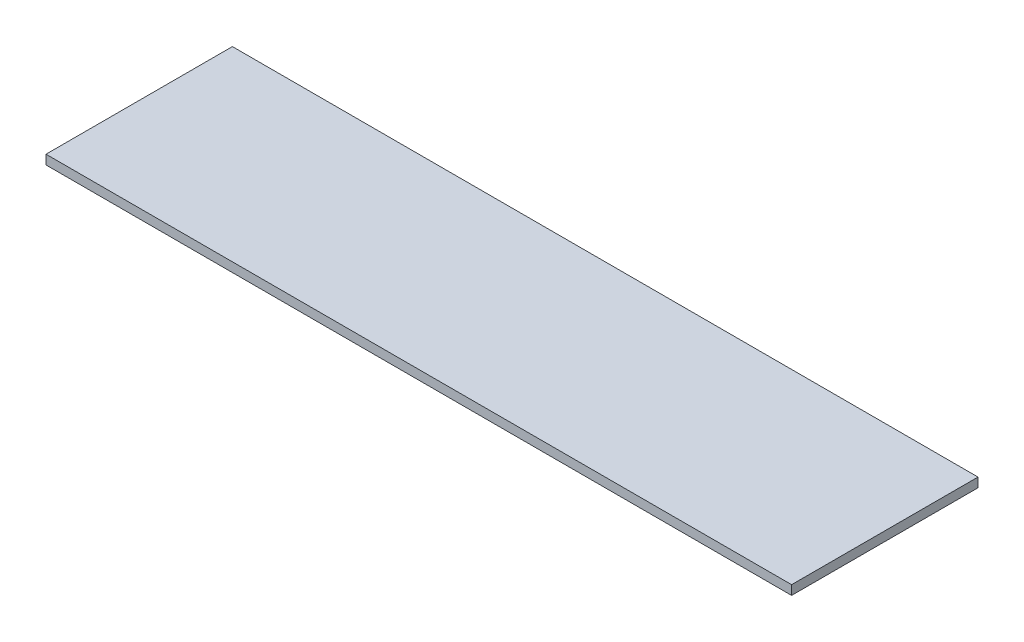
ISO-10303-21;
HEADER;
FILE_DESCRIPTION(('STEP AP214'),'2;1');
FILE_NAME('part.step','',(''),(''),'','','');
FILE_SCHEMA(('AUTOMOTIVE_DESIGN { 1 0 10303 214 1 1 1 1 }'));
ENDSEC;
DATA;
#1=APPLICATION_CONTEXT('core data for automotive mechanical design processes');
#2=APPLICATION_PROTOCOL_DEFINITION('international standard','automotive_design',2000,#1);
#3=PRODUCT_CONTEXT('',#1,'mechanical');
#4=PRODUCT('Part','Part','',(#3));
#5=PRODUCT_RELATED_PRODUCT_CATEGORY('part','',(#4));
#6=PRODUCT_DEFINITION_FORMATION('','',#4);
#7=PRODUCT_DEFINITION_CONTEXT('part definition',#1,'design');
#8=PRODUCT_DEFINITION('design','',#6,#7);
#9=PRODUCT_DEFINITION_SHAPE('','',#8);
#10=(LENGTH_UNIT() NAMED_UNIT(*) SI_UNIT(.MILLI.,.METRE.));
#11=(NAMED_UNIT(*) PLANE_ANGLE_UNIT() SI_UNIT($,.RADIAN.));
#12=(NAMED_UNIT(*) SI_UNIT($,.STERADIAN.) SOLID_ANGLE_UNIT());
#13=UNCERTAINTY_MEASURE_WITH_UNIT(LENGTH_MEASURE(1.E-05),#10,'distance_accuracy_value','');
#14=(GEOMETRIC_REPRESENTATION_CONTEXT(3) GLOBAL_UNCERTAINTY_ASSIGNED_CONTEXT((#13)) GLOBAL_UNIT_ASSIGNED_CONTEXT((#10,
#11,#12)) REPRESENTATION_CONTEXT('',''));
#15=CARTESIAN_POINT('',(0.,0.,0.));
#16=DIRECTION('',(0.,0.,1.));
#17=DIRECTION('',(1.,0.,0.));
#18=AXIS2_PLACEMENT_3D('',#15,#16,#17);
#19=CARTESIAN_POINT('',(200.,5.,-50.));
#20=DIRECTION('',(-1.,0.,0.));
#21=DIRECTION('',(0.,0.,1.));
#22=AXIS2_PLACEMENT_3D('',#19,#20,#21);
#23=PLANE('',#22);
#24=DIRECTION('',(0.,0.,-1.));
#25=VECTOR('',#24,1.);
#26=CARTESIAN_POINT('',(200.,0.,-50.));
#27=LINE('',#26,#25);
#28=CARTESIAN_POINT('',(200.,0.,50.));
#29=VERTEX_POINT('',#28);
#30=CARTESIAN_POINT('',(200.,0.,-50.));
#31=VERTEX_POINT('',#30);
#32=EDGE_CURVE('E96',#29,#31,#27,.T.);
#33=ORIENTED_EDGE('',*,*,#32,.T.);
#34=DIRECTION('',(0.,-1.,0.));
#35=VECTOR('',#34,1.);
#36=CARTESIAN_POINT('',(200.,5.,-50.));
#37=LINE('',#36,#35);
#38=CARTESIAN_POINT('',(200.,5.,-50.));
#39=VERTEX_POINT('',#38);
#40=EDGE_CURVE('E11',#39,#31,#37,.T.);
#41=ORIENTED_EDGE('',*,*,#40,.F.);
#42=DIRECTION('',(0.,0.,-1.));
#43=VECTOR('',#42,1.);
#44=CARTESIAN_POINT('',(200.,5.,-50.));
#45=LINE('',#44,#43);
#46=CARTESIAN_POINT('',(200.,5.,50.));
#47=VERTEX_POINT('',#46);
#48=EDGE_CURVE('E84',#47,#39,#45,.T.);
#49=ORIENTED_EDGE('',*,*,#48,.F.);
#50=DIRECTION('',(0.,-1.,0.));
#51=VECTOR('',#50,1.);
#52=CARTESIAN_POINT('',(200.,5.,50.));
#53=LINE('',#52,#51);
#54=EDGE_CURVE('E92',#47,#29,#53,.T.);
#55=ORIENTED_EDGE('',*,*,#54,.T.);
#56=EDGE_LOOP('',(#33,#41,#49,#55));
#57=FACE_BOUND('',#56,.T.);
#58=ADVANCED_FACE('F33',(#57),#23,.F.);
#59=CARTESIAN_POINT('',(-200.,5.,-50.));
#60=DIRECTION('',(0.,0.,1.));
#61=DIRECTION('',(1.,0.,0.));
#62=AXIS2_PLACEMENT_3D('',#59,#60,#61);
#63=PLANE('',#62);
#64=DIRECTION('',(-1.,0.,0.));
#65=VECTOR('',#64,1.);
#66=CARTESIAN_POINT('',(-200.,0.,-50.));
#67=LINE('',#66,#65);
#68=CARTESIAN_POINT('',(-200.,0.,-50.));
#69=VERTEX_POINT('',#68);
#70=EDGE_CURVE('E88',#31,#69,#67,.T.);
#71=ORIENTED_EDGE('',*,*,#70,.T.);
#72=DIRECTION('',(0.,-1.,0.));
#73=VECTOR('',#72,1.);
#74=CARTESIAN_POINT('',(-200.,5.,-50.));
#75=LINE('',#74,#73);
#76=CARTESIAN_POINT('',(-200.,5.,-50.));
#77=VERTEX_POINT('',#76);
#78=EDGE_CURVE('E41',#77,#69,#75,.T.);
#79=ORIENTED_EDGE('',*,*,#78,.F.);
#80=DIRECTION('',(-1.,0.,0.));
#81=VECTOR('',#80,1.);
#82=CARTESIAN_POINT('',(-200.,5.,-50.));
#83=LINE('',#82,#81);
#84=EDGE_CURVE('E79',#39,#77,#83,.T.);
#85=ORIENTED_EDGE('',*,*,#84,.F.);
#86=ORIENTED_EDGE('',*,*,#40,.T.);
#87=EDGE_LOOP('',(#71,#79,#85,#86));
#88=FACE_BOUND('',#87,.T.);
#89=ADVANCED_FACE('F87',(#88),#63,.F.);
#90=CARTESIAN_POINT('',(-200.,5.,-50.));
#91=DIRECTION('',(1.,0.,0.));
#92=DIRECTION('',(0.,0.,-1.));
#93=AXIS2_PLACEMENT_3D('',#90,#91,#92);
#94=PLANE('',#93);
#95=DIRECTION('',(0.,0.,1.));
#96=VECTOR('',#95,1.);
#97=CARTESIAN_POINT('',(-200.,0.,-50.));
#98=LINE('',#97,#96);
#99=CARTESIAN_POINT('',(-200.,0.,50.));
#100=VERTEX_POINT('',#99);
#101=EDGE_CURVE('E66',#69,#100,#98,.T.);
#102=ORIENTED_EDGE('',*,*,#101,.T.);
#103=DIRECTION('',(0.,-1.,0.));
#104=VECTOR('',#103,1.);
#105=CARTESIAN_POINT('',(-200.,5.,50.));
#106=LINE('',#105,#104);
#107=CARTESIAN_POINT('',(-200.,5.,50.));
#108=VERTEX_POINT('',#107);
#109=EDGE_CURVE('E89',#108,#100,#106,.T.);
#110=ORIENTED_EDGE('',*,*,#109,.F.);
#111=DIRECTION('',(0.,0.,1.));
#112=VECTOR('',#111,1.);
#113=CARTESIAN_POINT('',(-200.,5.,-50.));
#114=LINE('',#113,#112);
#115=EDGE_CURVE('E82',#77,#108,#114,.T.);
#116=ORIENTED_EDGE('',*,*,#115,.F.);
#117=ORIENTED_EDGE('',*,*,#78,.T.);
#118=EDGE_LOOP('',(#102,#110,#116,#117));
#119=FACE_BOUND('',#118,.T.);
#120=ADVANCED_FACE('F90',(#119),#94,.F.);
#121=CARTESIAN_POINT('',(-200.,5.,50.));
#122=DIRECTION('',(0.,0.,-1.));
#123=DIRECTION('',(-1.,0.,0.));
#124=AXIS2_PLACEMENT_3D('',#121,#122,#123);
#125=PLANE('',#124);
#126=DIRECTION('',(1.,0.,0.));
#127=VECTOR('',#126,1.);
#128=CARTESIAN_POINT('',(-200.,0.,50.));
#129=LINE('',#128,#127);
#130=EDGE_CURVE('E72',#100,#29,#129,.T.);
#131=ORIENTED_EDGE('',*,*,#130,.T.);
#132=ORIENTED_EDGE('',*,*,#54,.F.);
#133=DIRECTION('',(1.,0.,0.));
#134=VECTOR('',#133,1.);
#135=CARTESIAN_POINT('',(-200.,5.,50.));
#136=LINE('',#135,#134);
#137=EDGE_CURVE('E49',#108,#47,#136,.T.);
#138=ORIENTED_EDGE('',*,*,#137,.F.);
#139=ORIENTED_EDGE('',*,*,#109,.T.);
#140=EDGE_LOOP('',(#131,#132,#138,#139));
#141=FACE_BOUND('',#140,.T.);
#142=ADVANCED_FACE('F103',(#141),#125,.F.);
#143=CARTESIAN_POINT('',(0.,5.,0.));
#144=DIRECTION('',(0.,1.,0.));
#145=DIRECTION('',(0.,0.,1.));
#146=AXIS2_PLACEMENT_3D('',#143,#144,#145);
#147=PLANE('',#146);
#148=ORIENTED_EDGE('',*,*,#48,.T.);
#149=ORIENTED_EDGE('',*,*,#84,.T.);
#150=ORIENTED_EDGE('',*,*,#115,.T.);
#151=ORIENTED_EDGE('',*,*,#137,.T.);
#152=EDGE_LOOP('',(#148,#149,#150,#151));
#153=FACE_BOUND('',#152,.T.);
#154=ADVANCED_FACE('F80',(#153),#147,.T.);
#155=CARTESIAN_POINT('',(0.,0.,0.));
#156=DIRECTION('',(0.,1.,0.));
#157=DIRECTION('',(0.,0.,1.));
#158=AXIS2_PLACEMENT_3D('',#155,#156,#157);
#159=PLANE('',#158);
#160=ORIENTED_EDGE('',*,*,#32,.F.);
#161=ORIENTED_EDGE('',*,*,#130,.F.);
#162=ORIENTED_EDGE('',*,*,#101,.F.);
#163=ORIENTED_EDGE('',*,*,#70,.F.);
#164=EDGE_LOOP('',(#160,#161,#162,#163));
#165=FACE_BOUND('',#164,.T.);
#166=ADVANCED_FACE('F106',(#165),#159,.F.);
#167=CLOSED_SHELL('',(#58,#89,#120,#142,#154,#166));
#168=MANIFOLD_SOLID_BREP('B2',#167);
#169=ADVANCED_BREP_SHAPE_REPRESENTATION('',(#18,#168),#14);
#170=SHAPE_DEFINITION_REPRESENTATION(#9,#169);
ENDSEC;
END-ISO-10303-21;
